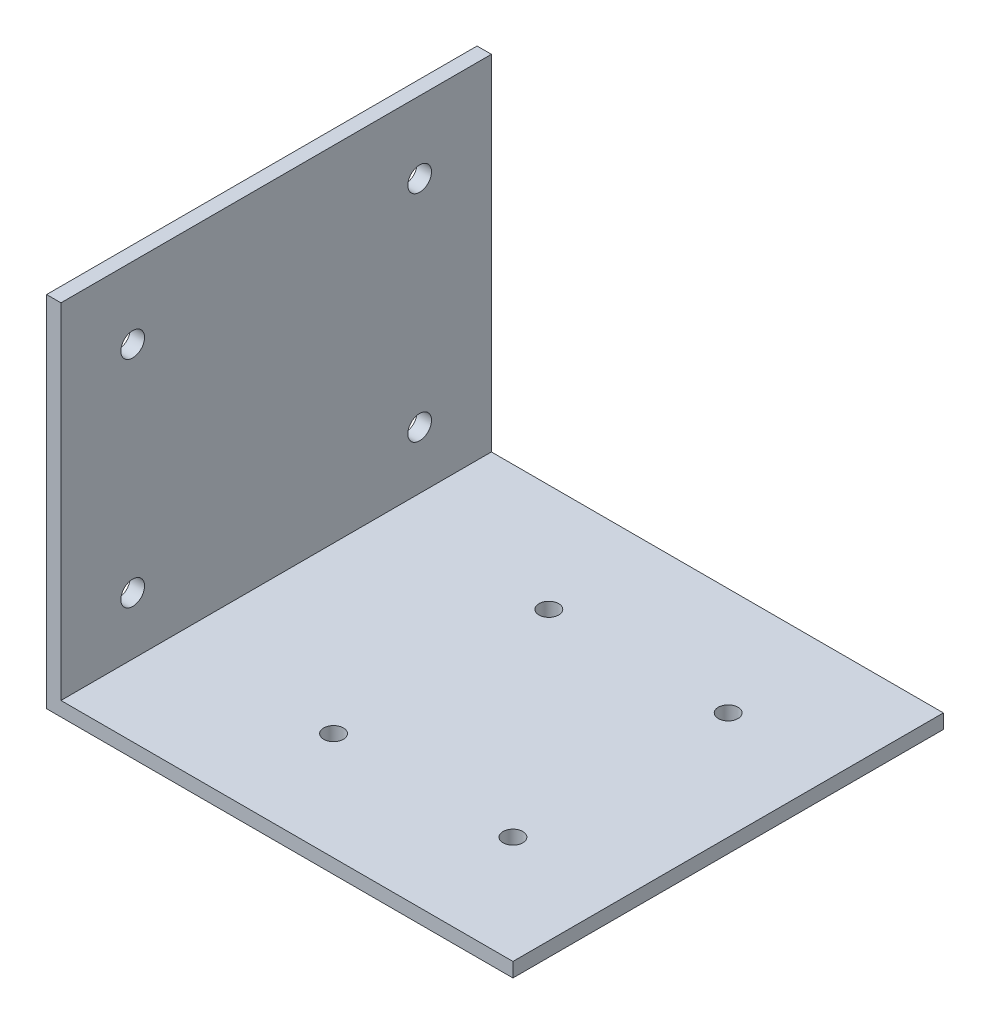
ISO-10303-21;
HEADER;
FILE_DESCRIPTION(('STEP AP214'),'2;1');
FILE_NAME('part.step','',(''),(''),'','','');
FILE_SCHEMA(('AUTOMOTIVE_DESIGN { 1 0 10303 214 1 1 1 1 }'));
ENDSEC;
DATA;
#1=APPLICATION_CONTEXT('core data for automotive mechanical design processes');
#2=APPLICATION_PROTOCOL_DEFINITION('international standard','automotive_design',2000,#1);
#3=PRODUCT_CONTEXT('',#1,'mechanical');
#4=PRODUCT('Part','Part','',(#3));
#5=PRODUCT_RELATED_PRODUCT_CATEGORY('part','',(#4));
#6=PRODUCT_DEFINITION_FORMATION('','',#4);
#7=PRODUCT_DEFINITION_CONTEXT('part definition',#1,'design');
#8=PRODUCT_DEFINITION('design','',#6,#7);
#9=PRODUCT_DEFINITION_SHAPE('','',#8);
#10=(LENGTH_UNIT() NAMED_UNIT(*) SI_UNIT(.MILLI.,.METRE.));
#11=(NAMED_UNIT(*) PLANE_ANGLE_UNIT() SI_UNIT($,.RADIAN.));
#12=(NAMED_UNIT(*) SI_UNIT($,.STERADIAN.) SOLID_ANGLE_UNIT());
#13=UNCERTAINTY_MEASURE_WITH_UNIT(LENGTH_MEASURE(1.E-05),#10,'distance_accuracy_value','');
#14=(GEOMETRIC_REPRESENTATION_CONTEXT(3) GLOBAL_UNCERTAINTY_ASSIGNED_CONTEXT((#13)) GLOBAL_UNIT_ASSIGNED_CONTEXT((#10,
#11,#12)) REPRESENTATION_CONTEXT('',''));
#15=CARTESIAN_POINT('',(0.,0.,0.));
#16=DIRECTION('',(0.,0.,1.));
#17=DIRECTION('',(1.,0.,0.));
#18=AXIS2_PLACEMENT_3D('',#15,#16,#17);
#19=CARTESIAN_POINT('',(130.,0.,120.));
#20=DIRECTION('',(0.,1.,0.));
#21=DIRECTION('',(-1.,0.,0.));
#22=AXIS2_PLACEMENT_3D('',#19,#20,#21);
#23=PLANE('',#22);
#24=CARTESIAN_POINT('',(100.,0.,90.));
#25=DIRECTION('',(0.,1.,0.));
#26=DIRECTION('',(-1.,0.,0.));
#27=AXIS2_PLACEMENT_3D('',#24,#25,#26);
#28=CIRCLE('',#27,2.75000000000001);
#29=CARTESIAN_POINT('',(97.25,0.,90.));
#30=VERTEX_POINT('',#29);
#31=EDGE_CURVE('E175',#30,#30,#28,.T.);
#32=ORIENTED_EDGE('',*,*,#31,.T.);
#33=EDGE_LOOP('',(#32));
#34=FACE_BOUND('',#33,.T.);
#35=CARTESIAN_POINT('',(50.,0.,90.));
#36=DIRECTION('',(0.,1.,0.));
#37=DIRECTION('',(-1.,0.,0.));
#38=AXIS2_PLACEMENT_3D('',#35,#36,#37);
#39=CIRCLE('',#38,2.75);
#40=CARTESIAN_POINT('',(47.25,0.,90.));
#41=VERTEX_POINT('',#40);
#42=EDGE_CURVE('E180',#41,#41,#39,.T.);
#43=ORIENTED_EDGE('',*,*,#42,.T.);
#44=EDGE_LOOP('',(#43));
#45=FACE_BOUND('',#44,.T.);
#46=CARTESIAN_POINT('',(50.,0.,30.));
#47=DIRECTION('',(0.,1.,0.));
#48=DIRECTION('',(-1.,0.,0.));
#49=AXIS2_PLACEMENT_3D('',#46,#47,#48);
#50=CIRCLE('',#49,2.75);
#51=CARTESIAN_POINT('',(47.25,0.,30.));
#52=VERTEX_POINT('',#51);
#53=EDGE_CURVE('E182',#52,#52,#50,.T.);
#54=ORIENTED_EDGE('',*,*,#53,.T.);
#55=EDGE_LOOP('',(#54));
#56=FACE_BOUND('',#55,.T.);
#57=CARTESIAN_POINT('',(100.,0.,30.));
#58=DIRECTION('',(0.,1.,0.));
#59=DIRECTION('',(-1.,0.,0.));
#60=AXIS2_PLACEMENT_3D('',#57,#58,#59);
#61=CIRCLE('',#60,2.75000000000001);
#62=CARTESIAN_POINT('',(97.25,0.,30.));
#63=VERTEX_POINT('',#62);
#64=EDGE_CURVE('E184',#63,#63,#61,.T.);
#65=ORIENTED_EDGE('',*,*,#64,.T.);
#66=EDGE_LOOP('',(#65));
#67=FACE_BOUND('',#66,.T.);
#68=DIRECTION('',(1.,0.,0.));
#69=VECTOR('',#68,1.);
#70=CARTESIAN_POINT('',(130.,0.,0.));
#71=LINE('',#70,#69);
#72=CARTESIAN_POINT('',(0.,0.,0.));
#73=VERTEX_POINT('',#72);
#74=CARTESIAN_POINT('',(130.,0.,0.));
#75=VERTEX_POINT('',#74);
#76=EDGE_CURVE('E121',#73,#75,#71,.T.);
#77=ORIENTED_EDGE('',*,*,#76,.T.);
#78=DIRECTION('',(0.,0.,-1.));
#79=VECTOR('',#78,1.);
#80=CARTESIAN_POINT('',(130.,0.,120.));
#81=LINE('',#80,#79);
#82=CARTESIAN_POINT('',(130.,0.,120.));
#83=VERTEX_POINT('',#82);
#84=EDGE_CURVE('E11',#83,#75,#81,.T.);
#85=ORIENTED_EDGE('',*,*,#84,.F.);
#86=DIRECTION('',(1.,0.,0.));
#87=VECTOR('',#86,1.);
#88=CARTESIAN_POINT('',(130.,0.,120.));
#89=LINE('',#88,#87);
#90=CARTESIAN_POINT('',(0.,0.,120.));
#91=VERTEX_POINT('',#90);
#92=EDGE_CURVE('E133',#91,#83,#89,.T.);
#93=ORIENTED_EDGE('',*,*,#92,.F.);
#94=DIRECTION('',(0.,0.,-1.));
#95=VECTOR('',#94,1.);
#96=CARTESIAN_POINT('',(0.,0.,120.));
#97=LINE('',#96,#95);
#98=EDGE_CURVE('E118',#91,#73,#97,.T.);
#99=ORIENTED_EDGE('',*,*,#98,.T.);
#100=EDGE_LOOP('',(#77,#85,#93,#99));
#101=FACE_BOUND('',#100,.T.);
#102=ADVANCED_FACE('F39',(#34,#45,#56,#67,#101),#23,.F.);
#103=CARTESIAN_POINT('',(130.,4.,120.));
#104=DIRECTION('',(-1.,0.,0.));
#105=DIRECTION('',(0.,0.,1.));
#106=AXIS2_PLACEMENT_3D('',#103,#104,#105);
#107=PLANE('',#106);
#108=DIRECTION('',(0.,1.,0.));
#109=VECTOR('',#108,1.);
#110=CARTESIAN_POINT('',(130.,4.,0.));
#111=LINE('',#110,#109);
#112=CARTESIAN_POINT('',(130.,4.,0.));
#113=VERTEX_POINT('',#112);
#114=EDGE_CURVE('E127',#75,#113,#111,.T.);
#115=ORIENTED_EDGE('',*,*,#114,.T.);
#116=DIRECTION('',(0.,0.,-1.));
#117=VECTOR('',#116,1.);
#118=CARTESIAN_POINT('',(130.,4.,120.));
#119=LINE('',#118,#117);
#120=CARTESIAN_POINT('',(130.,4.,120.));
#121=VERTEX_POINT('',#120);
#122=EDGE_CURVE('E50',#121,#113,#119,.T.);
#123=ORIENTED_EDGE('',*,*,#122,.F.);
#124=DIRECTION('',(0.,1.,0.));
#125=VECTOR('',#124,1.);
#126=CARTESIAN_POINT('',(130.,4.,120.));
#127=LINE('',#126,#125);
#128=EDGE_CURVE('E95',#83,#121,#127,.T.);
#129=ORIENTED_EDGE('',*,*,#128,.F.);
#130=ORIENTED_EDGE('',*,*,#84,.T.);
#131=EDGE_LOOP('',(#115,#123,#129,#130));
#132=FACE_BOUND('',#131,.T.);
#133=ADVANCED_FACE('F162',(#132),#107,.F.);
#134=CARTESIAN_POINT('',(4.00000000000001,4.,120.));
#135=DIRECTION('',(0.,-1.,0.));
#136=DIRECTION('',(1.,0.,0.));
#137=AXIS2_PLACEMENT_3D('',#134,#135,#136);
#138=PLANE('',#137);
#139=CARTESIAN_POINT('',(100.,4.,90.));
#140=DIRECTION('',(0.,1.,0.));
#141=DIRECTION('',(-1.,0.,0.));
#142=AXIS2_PLACEMENT_3D('',#139,#140,#141);
#143=CIRCLE('',#142,2.75000000000001);
#144=CARTESIAN_POINT('',(97.25,4.,90.));
#145=VERTEX_POINT('',#144);
#146=EDGE_CURVE('E351',#145,#145,#143,.T.);
#147=ORIENTED_EDGE('',*,*,#146,.F.);
#148=EDGE_LOOP('',(#147));
#149=FACE_BOUND('',#148,.T.);
#150=CARTESIAN_POINT('',(50.,4.,90.));
#151=DIRECTION('',(0.,1.,0.));
#152=DIRECTION('',(-1.,0.,0.));
#153=AXIS2_PLACEMENT_3D('',#150,#151,#152);
#154=CIRCLE('',#153,2.75);
#155=CARTESIAN_POINT('',(47.25,4.,90.));
#156=VERTEX_POINT('',#155);
#157=EDGE_CURVE('E355',#156,#156,#154,.T.);
#158=ORIENTED_EDGE('',*,*,#157,.F.);
#159=EDGE_LOOP('',(#158));
#160=FACE_BOUND('',#159,.T.);
#161=CARTESIAN_POINT('',(50.,4.,30.));
#162=DIRECTION('',(0.,1.,0.));
#163=DIRECTION('',(-1.,0.,0.));
#164=AXIS2_PLACEMENT_3D('',#161,#162,#163);
#165=CIRCLE('',#164,2.75);
#166=CARTESIAN_POINT('',(47.25,4.,30.));
#167=VERTEX_POINT('',#166);
#168=EDGE_CURVE('E192',#167,#167,#165,.T.);
#169=ORIENTED_EDGE('',*,*,#168,.F.);
#170=EDGE_LOOP('',(#169));
#171=FACE_BOUND('',#170,.T.);
#172=CARTESIAN_POINT('',(100.,4.,30.));
#173=DIRECTION('',(0.,1.,0.));
#174=DIRECTION('',(-1.,0.,0.));
#175=AXIS2_PLACEMENT_3D('',#172,#173,#174);
#176=CIRCLE('',#175,2.75000000000001);
#177=CARTESIAN_POINT('',(97.25,4.,30.));
#178=VERTEX_POINT('',#177);
#179=EDGE_CURVE('E186',#178,#178,#176,.T.);
#180=ORIENTED_EDGE('',*,*,#179,.F.);
#181=EDGE_LOOP('',(#180));
#182=FACE_BOUND('',#181,.T.);
#183=DIRECTION('',(-1.,0.,0.));
#184=VECTOR('',#183,1.);
#185=CARTESIAN_POINT('',(4.00000000000001,4.,0.));
#186=LINE('',#185,#184);
#187=CARTESIAN_POINT('',(4.00000000000001,4.,0.));
#188=VERTEX_POINT('',#187);
#189=EDGE_CURVE('E129',#113,#188,#186,.T.);
#190=ORIENTED_EDGE('',*,*,#189,.T.);
#191=DIRECTION('',(0.,0.,-1.));
#192=VECTOR('',#191,1.);
#193=CARTESIAN_POINT('',(4.00000000000001,4.,120.));
#194=LINE('',#193,#192);
#195=CARTESIAN_POINT('',(4.00000000000001,4.,120.));
#196=VERTEX_POINT('',#195);
#197=EDGE_CURVE('E111',#196,#188,#194,.T.);
#198=ORIENTED_EDGE('',*,*,#197,.F.);
#199=DIRECTION('',(-1.,0.,0.));
#200=VECTOR('',#199,1.);
#201=CARTESIAN_POINT('',(4.00000000000001,4.,120.));
#202=LINE('',#201,#200);
#203=EDGE_CURVE('E104',#121,#196,#202,.T.);
#204=ORIENTED_EDGE('',*,*,#203,.F.);
#205=ORIENTED_EDGE('',*,*,#122,.T.);
#206=EDGE_LOOP('',(#190,#198,#204,#205));
#207=FACE_BOUND('',#206,.T.);
#208=ADVANCED_FACE('F140',(#149,#160,#171,#182,#207),#138,.F.);
#209=CARTESIAN_POINT('',(4.,100.,120.));
#210=DIRECTION('',(-1.,0.,0.));
#211=DIRECTION('',(0.,-1.,0.));
#212=AXIS2_PLACEMENT_3D('',#209,#210,#211);
#213=PLANE('',#212);
#214=CARTESIAN_POINT('',(4.00000000000001,20.,100.));
#215=DIRECTION('',(1.,0.,0.));
#216=DIRECTION('',(0.,1.,0.));
#217=AXIS2_PLACEMENT_3D('',#214,#215,#216);
#218=CIRCLE('',#217,3.30000000000001);
#219=CARTESIAN_POINT('',(4.00000000000001,23.3,100.));
#220=VERTEX_POINT('',#219);
#221=EDGE_CURVE('E188',#220,#220,#218,.T.);
#222=ORIENTED_EDGE('',*,*,#221,.F.);
#223=EDGE_LOOP('',(#222));
#224=FACE_BOUND('',#223,.T.);
#225=CARTESIAN_POINT('',(4.00000000000001,20.,20.));
#226=DIRECTION('',(1.,0.,0.));
#227=DIRECTION('',(0.,1.,0.));
#228=AXIS2_PLACEMENT_3D('',#225,#226,#227);
#229=CIRCLE('',#228,3.3);
#230=CARTESIAN_POINT('',(4.00000000000001,23.3,20.));
#231=VERTEX_POINT('',#230);
#232=EDGE_CURVE('E204',#231,#231,#229,.T.);
#233=ORIENTED_EDGE('',*,*,#232,.F.);
#234=EDGE_LOOP('',(#233));
#235=FACE_BOUND('',#234,.T.);
#236=CARTESIAN_POINT('',(4.,80.,20.));
#237=DIRECTION('',(1.,0.,0.));
#238=DIRECTION('',(0.,1.,0.));
#239=AXIS2_PLACEMENT_3D('',#236,#237,#238);
#240=CIRCLE('',#239,3.3);
#241=CARTESIAN_POINT('',(4.,83.3,20.));
#242=VERTEX_POINT('',#241);
#243=EDGE_CURVE('E197',#242,#242,#240,.T.);
#244=ORIENTED_EDGE('',*,*,#243,.F.);
#245=EDGE_LOOP('',(#244));
#246=FACE_BOUND('',#245,.T.);
#247=CARTESIAN_POINT('',(4.,80.,100.));
#248=DIRECTION('',(1.,0.,0.));
#249=DIRECTION('',(0.,1.,0.));
#250=AXIS2_PLACEMENT_3D('',#247,#248,#249);
#251=CIRCLE('',#250,3.3);
#252=CARTESIAN_POINT('',(4.,83.3,100.));
#253=VERTEX_POINT('',#252);
#254=EDGE_CURVE('E199',#253,#253,#251,.T.);
#255=ORIENTED_EDGE('',*,*,#254,.F.);
#256=EDGE_LOOP('',(#255));
#257=FACE_BOUND('',#256,.T.);
#258=DIRECTION('',(0.,1.,0.));
#259=VECTOR('',#258,1.);
#260=CARTESIAN_POINT('',(4.,100.,0.));
#261=LINE('',#260,#259);
#262=CARTESIAN_POINT('',(4.,100.,0.));
#263=VERTEX_POINT('',#262);
#264=EDGE_CURVE('E114',#188,#263,#261,.T.);
#265=ORIENTED_EDGE('',*,*,#264,.T.);
#266=DIRECTION('',(0.,0.,-1.));
#267=VECTOR('',#266,1.);
#268=CARTESIAN_POINT('',(4.,100.,120.));
#269=LINE('',#268,#267);
#270=CARTESIAN_POINT('',(4.,100.,120.));
#271=VERTEX_POINT('',#270);
#272=EDGE_CURVE('E109',#271,#263,#269,.T.);
#273=ORIENTED_EDGE('',*,*,#272,.F.);
#274=DIRECTION('',(0.,1.,0.));
#275=VECTOR('',#274,1.);
#276=CARTESIAN_POINT('',(4.,100.,120.));
#277=LINE('',#276,#275);
#278=EDGE_CURVE('E97',#196,#271,#277,.T.);
#279=ORIENTED_EDGE('',*,*,#278,.F.);
#280=ORIENTED_EDGE('',*,*,#197,.T.);
#281=EDGE_LOOP('',(#265,#273,#279,#280));
#282=FACE_BOUND('',#281,.T.);
#283=ADVANCED_FACE('F112',(#224,#235,#246,#257,#282),#213,.F.);
#284=CARTESIAN_POINT('',(0.,100.,120.));
#285=DIRECTION('',(0.,-1.,0.));
#286=DIRECTION('',(0.,0.,-1.));
#287=AXIS2_PLACEMENT_3D('',#284,#285,#286);
#288=PLANE('',#287);
#289=DIRECTION('',(-1.,0.,0.));
#290=VECTOR('',#289,1.);
#291=CARTESIAN_POINT('',(0.,100.,0.));
#292=LINE('',#291,#290);
#293=CARTESIAN_POINT('',(0.,100.,0.));
#294=VERTEX_POINT('',#293);
#295=EDGE_CURVE('E80',#263,#294,#292,.T.);
#296=ORIENTED_EDGE('',*,*,#295,.T.);
#297=DIRECTION('',(0.,0.,-1.));
#298=VECTOR('',#297,1.);
#299=CARTESIAN_POINT('',(0.,100.,120.));
#300=LINE('',#299,#298);
#301=CARTESIAN_POINT('',(0.,100.,120.));
#302=VERTEX_POINT('',#301);
#303=EDGE_CURVE('E113',#302,#294,#300,.T.);
#304=ORIENTED_EDGE('',*,*,#303,.F.);
#305=DIRECTION('',(-1.,0.,0.));
#306=VECTOR('',#305,1.);
#307=CARTESIAN_POINT('',(0.,100.,120.));
#308=LINE('',#307,#306);
#309=EDGE_CURVE('E103',#271,#302,#308,.T.);
#310=ORIENTED_EDGE('',*,*,#309,.F.);
#311=ORIENTED_EDGE('',*,*,#272,.T.);
#312=EDGE_LOOP('',(#296,#304,#310,#311));
#313=FACE_BOUND('',#312,.T.);
#314=ADVANCED_FACE('F116',(#313),#288,.F.);
#315=CARTESIAN_POINT('',(0.,0.,120.));
#316=DIRECTION('',(1.,0.,0.));
#317=DIRECTION('',(0.,0.,-1.));
#318=AXIS2_PLACEMENT_3D('',#315,#316,#317);
#319=PLANE('',#318);
#320=CARTESIAN_POINT('',(0.,20.,100.));
#321=DIRECTION('',(1.,0.,0.));
#322=DIRECTION('',(0.,1.,0.));
#323=AXIS2_PLACEMENT_3D('',#320,#321,#322);
#324=CIRCLE('',#323,3.30000000000001);
#325=CARTESIAN_POINT('',(0.,23.3,100.));
#326=VERTEX_POINT('',#325);
#327=EDGE_CURVE('E189',#326,#326,#324,.T.);
#328=ORIENTED_EDGE('',*,*,#327,.T.);
#329=EDGE_LOOP('',(#328));
#330=FACE_BOUND('',#329,.T.);
#331=CARTESIAN_POINT('',(0.,20.,20.));
#332=DIRECTION('',(1.,0.,0.));
#333=DIRECTION('',(0.,1.,0.));
#334=AXIS2_PLACEMENT_3D('',#331,#332,#333);
#335=CIRCLE('',#334,3.3);
#336=CARTESIAN_POINT('',(0.,23.3,20.));
#337=VERTEX_POINT('',#336);
#338=EDGE_CURVE('E210',#337,#337,#335,.T.);
#339=ORIENTED_EDGE('',*,*,#338,.T.);
#340=EDGE_LOOP('',(#339));
#341=FACE_BOUND('',#340,.T.);
#342=CARTESIAN_POINT('',(0.,80.,20.));
#343=DIRECTION('',(1.,0.,0.));
#344=DIRECTION('',(0.,1.,0.));
#345=AXIS2_PLACEMENT_3D('',#342,#343,#344);
#346=CIRCLE('',#345,3.3);
#347=CARTESIAN_POINT('',(0.,83.3,20.));
#348=VERTEX_POINT('',#347);
#349=EDGE_CURVE('E203',#348,#348,#346,.T.);
#350=ORIENTED_EDGE('',*,*,#349,.T.);
#351=EDGE_LOOP('',(#350));
#352=FACE_BOUND('',#351,.T.);
#353=CARTESIAN_POINT('',(0.,80.,100.));
#354=DIRECTION('',(1.,0.,0.));
#355=DIRECTION('',(0.,1.,0.));
#356=AXIS2_PLACEMENT_3D('',#353,#354,#355);
#357=CIRCLE('',#356,3.3);
#358=CARTESIAN_POINT('',(0.,83.3,100.));
#359=VERTEX_POINT('',#358);
#360=EDGE_CURVE('E130',#359,#359,#357,.T.);
#361=ORIENTED_EDGE('',*,*,#360,.T.);
#362=EDGE_LOOP('',(#361));
#363=FACE_BOUND('',#362,.T.);
#364=DIRECTION('',(0.,-1.,0.));
#365=VECTOR('',#364,1.);
#366=CARTESIAN_POINT('',(0.,0.,0.));
#367=LINE('',#366,#365);
#368=EDGE_CURVE('E83',#294,#73,#367,.T.);
#369=ORIENTED_EDGE('',*,*,#368,.T.);
#370=ORIENTED_EDGE('',*,*,#98,.F.);
#371=DIRECTION('',(0.,-1.,0.));
#372=VECTOR('',#371,1.);
#373=CARTESIAN_POINT('',(0.,0.,120.));
#374=LINE('',#373,#372);
#375=EDGE_CURVE('E54',#302,#91,#374,.T.);
#376=ORIENTED_EDGE('',*,*,#375,.F.);
#377=ORIENTED_EDGE('',*,*,#303,.T.);
#378=EDGE_LOOP('',(#369,#370,#376,#377));
#379=FACE_BOUND('',#378,.T.);
#380=ADVANCED_FACE('F150',(#330,#341,#352,#363,#379),#319,.F.);
#381=CARTESIAN_POINT('',(0.,0.,120.));
#382=DIRECTION('',(0.,0.,-1.));
#383=DIRECTION('',(-1.,0.,0.));
#384=AXIS2_PLACEMENT_3D('',#381,#382,#383);
#385=PLANE('',#384);
#386=ORIENTED_EDGE('',*,*,#92,.T.);
#387=ORIENTED_EDGE('',*,*,#128,.T.);
#388=ORIENTED_EDGE('',*,*,#203,.T.);
#389=ORIENTED_EDGE('',*,*,#278,.T.);
#390=ORIENTED_EDGE('',*,*,#309,.T.);
#391=ORIENTED_EDGE('',*,*,#375,.T.);
#392=EDGE_LOOP('',(#386,#387,#388,#389,#390,#391));
#393=FACE_BOUND('',#392,.T.);
#394=ADVANCED_FACE('F101',(#393),#385,.F.);
#395=CARTESIAN_POINT('',(0.,0.,0.));
#396=DIRECTION('',(0.,0.,-1.));
#397=DIRECTION('',(-1.,0.,0.));
#398=AXIS2_PLACEMENT_3D('',#395,#396,#397);
#399=PLANE('',#398);
#400=ORIENTED_EDGE('',*,*,#76,.F.);
#401=ORIENTED_EDGE('',*,*,#368,.F.);
#402=ORIENTED_EDGE('',*,*,#295,.F.);
#403=ORIENTED_EDGE('',*,*,#264,.F.);
#404=ORIENTED_EDGE('',*,*,#189,.F.);
#405=ORIENTED_EDGE('',*,*,#114,.F.);
#406=EDGE_LOOP('',(#400,#401,#402,#403,#404,#405));
#407=FACE_BOUND('',#406,.T.);
#408=ADVANCED_FACE('F141',(#407),#399,.T.);
#409=CARTESIAN_POINT('',(0.,80.,100.));
#410=DIRECTION('',(1.,0.,0.));
#411=DIRECTION('',(0.,1.,0.));
#412=AXIS2_PLACEMENT_3D('',#409,#410,#411);
#413=CYLINDRICAL_SURFACE('',#412,3.3);
#414=ORIENTED_EDGE('',*,*,#360,.F.);
#415=EDGE_LOOP('',(#414));
#416=FACE_BOUND('',#415,.T.);
#417=ORIENTED_EDGE('',*,*,#254,.T.);
#418=EDGE_LOOP('',(#417));
#419=FACE_BOUND('',#418,.T.);
#420=ADVANCED_FACE('F218',(#416,#419),#413,.F.);
#421=CARTESIAN_POINT('',(0.,80.,20.));
#422=DIRECTION('',(1.,0.,0.));
#423=DIRECTION('',(0.,1.,0.));
#424=AXIS2_PLACEMENT_3D('',#421,#422,#423);
#425=CYLINDRICAL_SURFACE('',#424,3.3);
#426=ORIENTED_EDGE('',*,*,#349,.F.);
#427=EDGE_LOOP('',(#426));
#428=FACE_BOUND('',#427,.T.);
#429=ORIENTED_EDGE('',*,*,#243,.T.);
#430=EDGE_LOOP('',(#429));
#431=FACE_BOUND('',#430,.T.);
#432=ADVANCED_FACE('F234',(#428,#431),#425,.F.);
#433=CARTESIAN_POINT('',(0.,20.,20.));
#434=DIRECTION('',(1.,0.,0.));
#435=DIRECTION('',(0.,1.,0.));
#436=AXIS2_PLACEMENT_3D('',#433,#434,#435);
#437=CYLINDRICAL_SURFACE('',#436,3.3);
#438=ORIENTED_EDGE('',*,*,#338,.F.);
#439=EDGE_LOOP('',(#438));
#440=FACE_BOUND('',#439,.T.);
#441=ORIENTED_EDGE('',*,*,#232,.T.);
#442=EDGE_LOOP('',(#441));
#443=FACE_BOUND('',#442,.T.);
#444=ADVANCED_FACE('F237',(#440,#443),#437,.F.);
#445=CARTESIAN_POINT('',(0.,20.,100.));
#446=DIRECTION('',(1.,0.,0.));
#447=DIRECTION('',(0.,1.,0.));
#448=AXIS2_PLACEMENT_3D('',#445,#446,#447);
#449=CYLINDRICAL_SURFACE('',#448,3.30000000000001);
#450=ORIENTED_EDGE('',*,*,#327,.F.);
#451=EDGE_LOOP('',(#450));
#452=FACE_BOUND('',#451,.T.);
#453=ORIENTED_EDGE('',*,*,#221,.T.);
#454=EDGE_LOOP('',(#453));
#455=FACE_BOUND('',#454,.T.);
#456=ADVANCED_FACE('F241',(#452,#455),#449,.F.);
#457=CARTESIAN_POINT('',(100.,0.,30.));
#458=DIRECTION('',(0.,1.,0.));
#459=DIRECTION('',(-1.,0.,0.));
#460=AXIS2_PLACEMENT_3D('',#457,#458,#459);
#461=CYLINDRICAL_SURFACE('',#460,2.75000000000001);
#462=ORIENTED_EDGE('',*,*,#64,.F.);
#463=EDGE_LOOP('',(#462));
#464=FACE_BOUND('',#463,.T.);
#465=ORIENTED_EDGE('',*,*,#179,.T.);
#466=EDGE_LOOP('',(#465));
#467=FACE_BOUND('',#466,.T.);
#468=ADVANCED_FACE('F248',(#464,#467),#461,.F.);
#469=CARTESIAN_POINT('',(50.,0.,30.));
#470=DIRECTION('',(0.,1.,0.));
#471=DIRECTION('',(-1.,0.,0.));
#472=AXIS2_PLACEMENT_3D('',#469,#470,#471);
#473=CYLINDRICAL_SURFACE('',#472,2.75);
#474=ORIENTED_EDGE('',*,*,#53,.F.);
#475=EDGE_LOOP('',(#474));
#476=FACE_BOUND('',#475,.T.);
#477=ORIENTED_EDGE('',*,*,#168,.T.);
#478=EDGE_LOOP('',(#477));
#479=FACE_BOUND('',#478,.T.);
#480=ADVANCED_FACE('F318',(#476,#479),#473,.F.);
#481=CARTESIAN_POINT('',(50.,0.,90.));
#482=DIRECTION('',(0.,1.,0.));
#483=DIRECTION('',(-1.,0.,0.));
#484=AXIS2_PLACEMENT_3D('',#481,#482,#483);
#485=CYLINDRICAL_SURFACE('',#484,2.75);
#486=ORIENTED_EDGE('',*,*,#42,.F.);
#487=EDGE_LOOP('',(#486));
#488=FACE_BOUND('',#487,.T.);
#489=ORIENTED_EDGE('',*,*,#157,.T.);
#490=EDGE_LOOP('',(#489));
#491=FACE_BOUND('',#490,.T.);
#492=ADVANCED_FACE('F324',(#488,#491),#485,.F.);
#493=CARTESIAN_POINT('',(100.,0.,90.));
#494=DIRECTION('',(0.,1.,0.));
#495=DIRECTION('',(-1.,0.,0.));
#496=AXIS2_PLACEMENT_3D('',#493,#494,#495);
#497=CYLINDRICAL_SURFACE('',#496,2.75000000000001);
#498=ORIENTED_EDGE('',*,*,#31,.F.);
#499=EDGE_LOOP('',(#498));
#500=FACE_BOUND('',#499,.T.);
#501=ORIENTED_EDGE('',*,*,#146,.T.);
#502=EDGE_LOOP('',(#501));
#503=FACE_BOUND('',#502,.T.);
#504=ADVANCED_FACE('F331',(#500,#503),#497,.F.);
#505=CLOSED_SHELL('',(#102,#133,#208,#283,#314,#380,#394,#408,#420,#432,#444,#456,#468,#480,
#492,#504));
#506=MANIFOLD_SOLID_BREP('B2',#505);
#507=ADVANCED_BREP_SHAPE_REPRESENTATION('',(#18,#506),#14);
#508=SHAPE_DEFINITION_REPRESENTATION(#9,#507);
ENDSEC;
END-ISO-10303-21;
